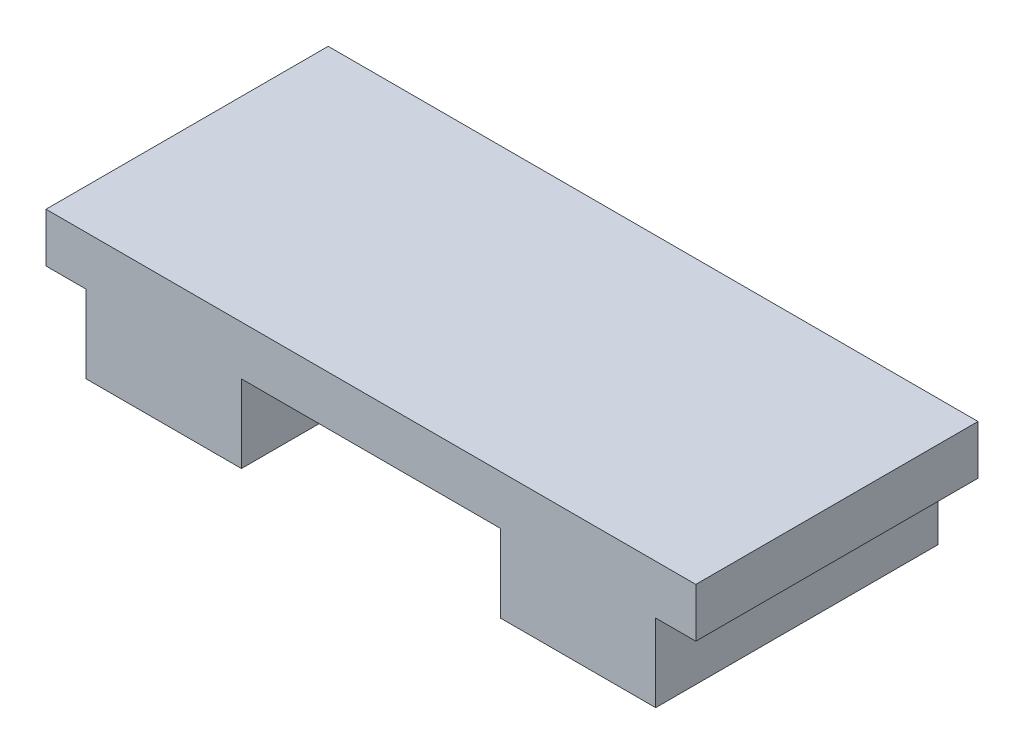
ISO-10303-21;
HEADER;
FILE_DESCRIPTION(('STEP AP214'),'2;1');
FILE_NAME('part.step','',(''),(''),'','','');
FILE_SCHEMA(('AUTOMOTIVE_DESIGN { 1 0 10303 214 1 1 1 1 }'));
ENDSEC;
DATA;
#1=APPLICATION_CONTEXT('core data for automotive mechanical design processes');
#2=APPLICATION_PROTOCOL_DEFINITION('international standard','automotive_design',2000,#1);
#3=PRODUCT_CONTEXT('',#1,'mechanical');
#4=PRODUCT('Part','Part','',(#3));
#5=PRODUCT_RELATED_PRODUCT_CATEGORY('part','',(#4));
#6=PRODUCT_DEFINITION_FORMATION('','',#4);
#7=PRODUCT_DEFINITION_CONTEXT('part definition',#1,'design');
#8=PRODUCT_DEFINITION('design','',#6,#7);
#9=PRODUCT_DEFINITION_SHAPE('','',#8);
#10=(LENGTH_UNIT() NAMED_UNIT(*) SI_UNIT(.MILLI.,.METRE.));
#11=(NAMED_UNIT(*) PLANE_ANGLE_UNIT() SI_UNIT($,.RADIAN.));
#12=(NAMED_UNIT(*) SI_UNIT($,.STERADIAN.) SOLID_ANGLE_UNIT());
#13=UNCERTAINTY_MEASURE_WITH_UNIT(LENGTH_MEASURE(1.E-05),#10,'distance_accuracy_value','');
#14=(GEOMETRIC_REPRESENTATION_CONTEXT(3) GLOBAL_UNCERTAINTY_ASSIGNED_CONTEXT((#13)) GLOBAL_UNIT_ASSIGNED_CONTEXT((#10,
#11,#12)) REPRESENTATION_CONTEXT('',''));
#15=CARTESIAN_POINT('',(0.,0.,0.));
#16=DIRECTION('',(0.,0.,1.));
#17=DIRECTION('',(1.,0.,0.));
#18=AXIS2_PLACEMENT_3D('',#15,#16,#17);
#19=CARTESIAN_POINT('',(0.,3.,0.));
#20=DIRECTION('',(0.,-1.,0.));
#21=DIRECTION('',(0.,0.,-1.));
#22=AXIS2_PLACEMENT_3D('',#19,#20,#21);
#23=PLANE('',#22);
#24=DIRECTION('',(1.,0.,0.));
#25=VECTOR('',#24,1.);
#26=CARTESIAN_POINT('',(-12.55,3.,5.45));
#27=LINE('',#26,#25);
#28=CARTESIAN_POINT('',(11.,3.,5.45));
#29=VERTEX_POINT('',#28);
#30=CARTESIAN_POINT('',(12.55,3.,5.45));
#31=VERTEX_POINT('',#30);
#32=EDGE_CURVE('E147',#29,#31,#27,.T.);
#33=ORIENTED_EDGE('',*,*,#32,.F.);
#34=DIRECTION('',(0.,0.,-1.));
#35=VECTOR('',#34,1.);
#36=CARTESIAN_POINT('',(11.,3.,5.45));
#37=LINE('',#36,#35);
#38=CARTESIAN_POINT('',(11.,3.,-5.45));
#39=VERTEX_POINT('',#38);
#40=EDGE_CURVE('E52',#29,#39,#37,.T.);
#41=ORIENTED_EDGE('',*,*,#40,.T.);
#42=DIRECTION('',(-1.,0.,0.));
#43=VECTOR('',#42,1.);
#44=CARTESIAN_POINT('',(-12.55,3.,-5.45));
#45=LINE('',#44,#43);
#46=CARTESIAN_POINT('',(12.55,3.,-5.45));
#47=VERTEX_POINT('',#46);
#48=EDGE_CURVE('E145',#47,#39,#45,.T.);
#49=ORIENTED_EDGE('',*,*,#48,.F.);
#50=DIRECTION('',(0.,0.,-1.));
#51=VECTOR('',#50,1.);
#52=CARTESIAN_POINT('',(12.55,3.,5.45));
#53=LINE('',#52,#51);
#54=EDGE_CURVE('E139',#31,#47,#53,.T.);
#55=ORIENTED_EDGE('',*,*,#54,.F.);
#56=EDGE_LOOP('',(#33,#41,#49,#55));
#57=FACE_BOUND('',#56,.T.);
#58=ADVANCED_FACE('F37',(#57),#23,.T.);
#59=CARTESIAN_POINT('',(5.,3.,-5.45));
#60=VERTEX_POINT('',#59);
#61=CARTESIAN_POINT('',(-5.,3.,-5.45));
#62=VERTEX_POINT('',#61);
#63=EDGE_CURVE('E85',#60,#62,#45,.T.);
#64=ORIENTED_EDGE('',*,*,#63,.F.);
#65=DIRECTION('',(0.,0.,1.));
#66=VECTOR('',#65,1.);
#67=CARTESIAN_POINT('',(5.,3.,5.45));
#68=LINE('',#67,#66);
#69=CARTESIAN_POINT('',(5.,3.,5.45));
#70=VERTEX_POINT('',#69);
#71=EDGE_CURVE('E148',#60,#70,#68,.T.);
#72=ORIENTED_EDGE('',*,*,#71,.T.);
#73=CARTESIAN_POINT('',(-5.,3.,5.45));
#74=VERTEX_POINT('',#73);
#75=EDGE_CURVE('E196',#74,#70,#27,.T.);
#76=ORIENTED_EDGE('',*,*,#75,.F.);
#77=DIRECTION('',(0.,0.,-1.));
#78=VECTOR('',#77,1.);
#79=CARTESIAN_POINT('',(-5.,3.,5.45));
#80=LINE('',#79,#78);
#81=EDGE_CURVE('E211',#74,#62,#80,.T.);
#82=ORIENTED_EDGE('',*,*,#81,.T.);
#83=EDGE_LOOP('',(#64,#72,#76,#82));
#84=FACE_BOUND('',#83,.T.);
#85=ADVANCED_FACE('F194',(#84),#23,.T.);
#86=CARTESIAN_POINT('',(-5.,3.,5.45));
#87=DIRECTION('',(-1.,0.,0.));
#88=DIRECTION('',(0.,0.,1.));
#89=AXIS2_PLACEMENT_3D('',#86,#87,#88);
#90=PLANE('',#89);
#91=DIRECTION('',(0.,0.,-1.));
#92=VECTOR('',#91,1.);
#93=CARTESIAN_POINT('',(-5.,0.,5.45));
#94=LINE('',#93,#92);
#95=CARTESIAN_POINT('',(-5.,0.,5.45));
#96=VERTEX_POINT('',#95);
#97=CARTESIAN_POINT('',(-5.,0.,-5.45));
#98=VERTEX_POINT('',#97);
#99=EDGE_CURVE('E210',#96,#98,#94,.T.);
#100=ORIENTED_EDGE('',*,*,#99,.T.);
#101=DIRECTION('',(0.,-1.,0.));
#102=VECTOR('',#101,1.);
#103=CARTESIAN_POINT('',(-5.,3.,-5.45));
#104=LINE('',#103,#102);
#105=EDGE_CURVE('E11',#62,#98,#104,.T.);
#106=ORIENTED_EDGE('',*,*,#105,.F.);
#107=ORIENTED_EDGE('',*,*,#81,.F.);
#108=DIRECTION('',(0.,-1.,0.));
#109=VECTOR('',#108,1.);
#110=CARTESIAN_POINT('',(-5.,3.,5.45));
#111=LINE('',#110,#109);
#112=EDGE_CURVE('E61',#74,#96,#111,.T.);
#113=ORIENTED_EDGE('',*,*,#112,.T.);
#114=EDGE_LOOP('',(#100,#106,#107,#113));
#115=FACE_BOUND('',#114,.T.);
#116=ADVANCED_FACE('F39',(#115),#90,.F.);
#117=CARTESIAN_POINT('',(-11.,3.,-5.45));
#118=DIRECTION('',(0.,0.,1.));
#119=DIRECTION('',(1.,0.,0.));
#120=AXIS2_PLACEMENT_3D('',#117,#118,#119);
#121=PLANE('',#120);
#122=DIRECTION('',(-1.,0.,0.));
#123=VECTOR('',#122,1.);
#124=CARTESIAN_POINT('',(-11.,0.,-5.45));
#125=LINE('',#124,#123);
#126=CARTESIAN_POINT('',(-11.,0.,-5.45));
#127=VERTEX_POINT('',#126);
#128=EDGE_CURVE('E218',#98,#127,#125,.T.);
#129=ORIENTED_EDGE('',*,*,#128,.T.);
#130=DIRECTION('',(0.,-1.,0.));
#131=VECTOR('',#130,1.);
#132=CARTESIAN_POINT('',(-11.,3.,-5.45));
#133=LINE('',#132,#131);
#134=CARTESIAN_POINT('',(-11.,3.,-5.45));
#135=VERTEX_POINT('',#134);
#136=EDGE_CURVE('E45',#135,#127,#133,.T.);
#137=ORIENTED_EDGE('',*,*,#136,.F.);
#138=CARTESIAN_POINT('',(-12.55,3.,-5.45));
#139=VERTEX_POINT('',#138);
#140=EDGE_CURVE('E157',#135,#139,#45,.T.);
#141=ORIENTED_EDGE('',*,*,#140,.T.);
#142=DIRECTION('',(0.,-1.,0.));
#143=VECTOR('',#142,1.);
#144=CARTESIAN_POINT('',(-12.55,4.9,-5.45));
#145=LINE('',#144,#143);
#146=CARTESIAN_POINT('',(-12.55,4.9,-5.45));
#147=VERTEX_POINT('',#146);
#148=EDGE_CURVE('E207',#147,#139,#145,.T.);
#149=ORIENTED_EDGE('',*,*,#148,.F.);
#150=DIRECTION('',(-1.,0.,0.));
#151=VECTOR('',#150,1.);
#152=CARTESIAN_POINT('',(-12.55,4.9,-5.45));
#153=LINE('',#152,#151);
#154=CARTESIAN_POINT('',(12.55,4.9,-5.45));
#155=VERTEX_POINT('',#154);
#156=EDGE_CURVE('E171',#155,#147,#153,.T.);
#157=ORIENTED_EDGE('',*,*,#156,.F.);
#158=DIRECTION('',(0.,-1.,0.));
#159=VECTOR('',#158,1.);
#160=CARTESIAN_POINT('',(12.55,4.9,-5.45));
#161=LINE('',#160,#159);
#162=EDGE_CURVE('E153',#155,#47,#161,.T.);
#163=ORIENTED_EDGE('',*,*,#162,.T.);
#164=ORIENTED_EDGE('',*,*,#48,.T.);
#165=DIRECTION('',(0.,-1.,0.));
#166=VECTOR('',#165,1.);
#167=CARTESIAN_POINT('',(11.,3.,-5.45));
#168=LINE('',#167,#166);
#169=CARTESIAN_POINT('',(11.,0.,-5.45));
#170=VERTEX_POINT('',#169);
#171=EDGE_CURVE('E134',#39,#170,#168,.T.);
#172=ORIENTED_EDGE('',*,*,#171,.T.);
#173=DIRECTION('',(-1.,0.,0.));
#174=VECTOR('',#173,1.);
#175=CARTESIAN_POINT('',(11.,0.,-5.45));
#176=LINE('',#175,#174);
#177=CARTESIAN_POINT('',(5.,0.,-5.45));
#178=VERTEX_POINT('',#177);
#179=EDGE_CURVE('E187',#170,#178,#176,.T.);
#180=ORIENTED_EDGE('',*,*,#179,.T.);
#181=DIRECTION('',(0.,-1.,0.));
#182=VECTOR('',#181,1.);
#183=CARTESIAN_POINT('',(5.,3.,-5.45));
#184=LINE('',#183,#182);
#185=EDGE_CURVE('E140',#60,#178,#184,.T.);
#186=ORIENTED_EDGE('',*,*,#185,.F.);
#187=ORIENTED_EDGE('',*,*,#63,.T.);
#188=ORIENTED_EDGE('',*,*,#105,.T.);
#189=EDGE_LOOP('',(#129,#137,#141,#149,#157,#163,#164,#172,#180,#186,#187,#188));
#190=FACE_BOUND('',#189,.T.);
#191=ADVANCED_FACE('F151',(#190),#121,.F.);
#192=CARTESIAN_POINT('',(-11.,3.,5.45));
#193=DIRECTION('',(1.,0.,0.));
#194=DIRECTION('',(0.,0.,-1.));
#195=AXIS2_PLACEMENT_3D('',#192,#193,#194);
#196=PLANE('',#195);
#197=DIRECTION('',(0.,0.,1.));
#198=VECTOR('',#197,1.);
#199=CARTESIAN_POINT('',(-11.,0.,5.45));
#200=LINE('',#199,#198);
#201=CARTESIAN_POINT('',(-11.,0.,5.45));
#202=VERTEX_POINT('',#201);
#203=EDGE_CURVE('E220',#127,#202,#200,.T.);
#204=ORIENTED_EDGE('',*,*,#203,.T.);
#205=DIRECTION('',(0.,-1.,0.));
#206=VECTOR('',#205,1.);
#207=CARTESIAN_POINT('',(-11.,3.,5.45));
#208=LINE('',#207,#206);
#209=CARTESIAN_POINT('',(-11.,3.,5.45));
#210=VERTEX_POINT('',#209);
#211=EDGE_CURVE('E224',#210,#202,#208,.T.);
#212=ORIENTED_EDGE('',*,*,#211,.F.);
#213=DIRECTION('',(0.,0.,1.));
#214=VECTOR('',#213,1.);
#215=CARTESIAN_POINT('',(-11.,3.,5.45));
#216=LINE('',#215,#214);
#217=EDGE_CURVE('E213',#135,#210,#216,.T.);
#218=ORIENTED_EDGE('',*,*,#217,.F.);
#219=ORIENTED_EDGE('',*,*,#136,.T.);
#220=EDGE_LOOP('',(#204,#212,#218,#219));
#221=FACE_BOUND('',#220,.T.);
#222=ADVANCED_FACE('F229',(#221),#196,.F.);
#223=CARTESIAN_POINT('',(-11.,3.,5.45));
#224=DIRECTION('',(0.,0.,-1.));
#225=DIRECTION('',(-1.,0.,0.));
#226=AXIS2_PLACEMENT_3D('',#223,#224,#225);
#227=PLANE('',#226);
#228=DIRECTION('',(1.,0.,0.));
#229=VECTOR('',#228,1.);
#230=CARTESIAN_POINT('',(-11.,0.,5.45));
#231=LINE('',#230,#229);
#232=EDGE_CURVE('E80',#202,#96,#231,.T.);
#233=ORIENTED_EDGE('',*,*,#232,.T.);
#234=ORIENTED_EDGE('',*,*,#112,.F.);
#235=ORIENTED_EDGE('',*,*,#75,.T.);
#236=DIRECTION('',(0.,-1.,0.));
#237=VECTOR('',#236,1.);
#238=CARTESIAN_POINT('',(5.,3.,5.45));
#239=LINE('',#238,#237);
#240=CARTESIAN_POINT('',(5.,0.,5.45));
#241=VERTEX_POINT('',#240);
#242=EDGE_CURVE('E179',#70,#241,#239,.T.);
#243=ORIENTED_EDGE('',*,*,#242,.T.);
#244=DIRECTION('',(1.,0.,0.));
#245=VECTOR('',#244,1.);
#246=CARTESIAN_POINT('',(11.,0.,5.45));
#247=LINE('',#246,#245);
#248=CARTESIAN_POINT('',(11.,0.,5.45));
#249=VERTEX_POINT('',#248);
#250=EDGE_CURVE('E149',#241,#249,#247,.T.);
#251=ORIENTED_EDGE('',*,*,#250,.T.);
#252=DIRECTION('',(0.,-1.,0.));
#253=VECTOR('',#252,1.);
#254=CARTESIAN_POINT('',(11.,3.,5.45));
#255=LINE('',#254,#253);
#256=EDGE_CURVE('E182',#29,#249,#255,.T.);
#257=ORIENTED_EDGE('',*,*,#256,.F.);
#258=ORIENTED_EDGE('',*,*,#32,.T.);
#259=DIRECTION('',(0.,-1.,0.));
#260=VECTOR('',#259,1.);
#261=CARTESIAN_POINT('',(12.55,4.9,5.45));
#262=LINE('',#261,#260);
#263=CARTESIAN_POINT('',(12.55,4.9,5.45));
#264=VERTEX_POINT('',#263);
#265=EDGE_CURVE('E168',#264,#31,#262,.T.);
#266=ORIENTED_EDGE('',*,*,#265,.F.);
#267=DIRECTION('',(1.,0.,0.));
#268=VECTOR('',#267,1.);
#269=CARTESIAN_POINT('',(-12.55,4.9,5.45));
#270=LINE('',#269,#268);
#271=CARTESIAN_POINT('',(-12.55,4.9,5.45));
#272=VERTEX_POINT('',#271);
#273=EDGE_CURVE('E166',#272,#264,#270,.T.);
#274=ORIENTED_EDGE('',*,*,#273,.F.);
#275=DIRECTION('',(0.,-1.,0.));
#276=VECTOR('',#275,1.);
#277=CARTESIAN_POINT('',(-12.55,4.9,5.45));
#278=LINE('',#277,#276);
#279=CARTESIAN_POINT('',(-12.55,3.,5.45));
#280=VERTEX_POINT('',#279);
#281=EDGE_CURVE('E204',#272,#280,#278,.T.);
#282=ORIENTED_EDGE('',*,*,#281,.T.);
#283=EDGE_CURVE('E175',#280,#210,#27,.T.);
#284=ORIENTED_EDGE('',*,*,#283,.T.);
#285=ORIENTED_EDGE('',*,*,#211,.T.);
#286=EDGE_LOOP('',(#233,#234,#235,#243,#251,#257,#258,#266,#274,#282,#284,#285));
#287=FACE_BOUND('',#286,.T.);
#288=ADVANCED_FACE('F198',(#287),#227,.F.);
#289=CARTESIAN_POINT('',(0.,0.,0.));
#290=DIRECTION('',(0.,-1.,0.));
#291=DIRECTION('',(0.,0.,-1.));
#292=AXIS2_PLACEMENT_3D('',#289,#290,#291);
#293=PLANE('',#292);
#294=ORIENTED_EDGE('',*,*,#99,.F.);
#295=ORIENTED_EDGE('',*,*,#232,.F.);
#296=ORIENTED_EDGE('',*,*,#203,.F.);
#297=ORIENTED_EDGE('',*,*,#128,.F.);
#298=EDGE_LOOP('',(#294,#295,#296,#297));
#299=FACE_BOUND('',#298,.T.);
#300=ADVANCED_FACE('F232',(#299),#293,.T.);
#301=CARTESIAN_POINT('',(12.55,4.9,5.45));
#302=DIRECTION('',(-1.,0.,0.));
#303=DIRECTION('',(0.,0.,1.));
#304=AXIS2_PLACEMENT_3D('',#301,#302,#303);
#305=PLANE('',#304);
#306=ORIENTED_EDGE('',*,*,#54,.T.);
#307=ORIENTED_EDGE('',*,*,#162,.F.);
#308=DIRECTION('',(0.,0.,-1.));
#309=VECTOR('',#308,1.);
#310=CARTESIAN_POINT('',(12.55,4.9,5.45));
#311=LINE('',#310,#309);
#312=EDGE_CURVE('E173',#264,#155,#311,.T.);
#313=ORIENTED_EDGE('',*,*,#312,.F.);
#314=ORIENTED_EDGE('',*,*,#265,.T.);
#315=EDGE_LOOP('',(#306,#307,#313,#314));
#316=FACE_BOUND('',#315,.T.);
#317=ADVANCED_FACE('F265',(#316),#305,.F.);
#318=CARTESIAN_POINT('',(-12.55,4.9,5.45));
#319=DIRECTION('',(1.,0.,0.));
#320=DIRECTION('',(0.,0.,-1.));
#321=AXIS2_PLACEMENT_3D('',#318,#319,#320);
#322=PLANE('',#321);
#323=DIRECTION('',(0.,0.,1.));
#324=VECTOR('',#323,1.);
#325=CARTESIAN_POINT('',(-12.55,3.,5.45));
#326=LINE('',#325,#324);
#327=EDGE_CURVE('E155',#139,#280,#326,.T.);
#328=ORIENTED_EDGE('',*,*,#327,.T.);
#329=ORIENTED_EDGE('',*,*,#281,.F.);
#330=DIRECTION('',(0.,0.,1.));
#331=VECTOR('',#330,1.);
#332=CARTESIAN_POINT('',(-12.55,4.9,5.45));
#333=LINE('',#332,#331);
#334=EDGE_CURVE('E169',#147,#272,#333,.T.);
#335=ORIENTED_EDGE('',*,*,#334,.F.);
#336=ORIENTED_EDGE('',*,*,#148,.T.);
#337=EDGE_LOOP('',(#328,#329,#335,#336));
#338=FACE_BOUND('',#337,.T.);
#339=ADVANCED_FACE('F255',(#338),#322,.F.);
#340=CARTESIAN_POINT('',(0.,4.9,0.));
#341=DIRECTION('',(0.,-1.,0.));
#342=DIRECTION('',(0.,0.,-1.));
#343=AXIS2_PLACEMENT_3D('',#340,#341,#342);
#344=PLANE('',#343);
#345=ORIENTED_EDGE('',*,*,#312,.T.);
#346=ORIENTED_EDGE('',*,*,#156,.T.);
#347=ORIENTED_EDGE('',*,*,#334,.T.);
#348=ORIENTED_EDGE('',*,*,#273,.T.);
#349=EDGE_LOOP('',(#345,#346,#347,#348));
#350=FACE_BOUND('',#349,.T.);
#351=ADVANCED_FACE('F247',(#350),#344,.F.);
#352=ORIENTED_EDGE('',*,*,#140,.F.);
#353=ORIENTED_EDGE('',*,*,#217,.T.);
#354=ORIENTED_EDGE('',*,*,#283,.F.);
#355=ORIENTED_EDGE('',*,*,#327,.F.);
#356=EDGE_LOOP('',(#352,#353,#354,#355));
#357=FACE_BOUND('',#356,.T.);
#358=ADVANCED_FACE('F240',(#357),#23,.T.);
#359=CARTESIAN_POINT('',(11.,3.,5.45));
#360=DIRECTION('',(-1.,0.,0.));
#361=DIRECTION('',(0.,0.,1.));
#362=AXIS2_PLACEMENT_3D('',#359,#360,#361);
#363=PLANE('',#362);
#364=DIRECTION('',(0.,0.,-1.));
#365=VECTOR('',#364,1.);
#366=CARTESIAN_POINT('',(11.,0.,5.45));
#367=LINE('',#366,#365);
#368=EDGE_CURVE('E137',#249,#170,#367,.T.);
#369=ORIENTED_EDGE('',*,*,#368,.T.);
#370=ORIENTED_EDGE('',*,*,#171,.F.);
#371=ORIENTED_EDGE('',*,*,#40,.F.);
#372=ORIENTED_EDGE('',*,*,#256,.T.);
#373=EDGE_LOOP('',(#369,#370,#371,#372));
#374=FACE_BOUND('',#373,.T.);
#375=ADVANCED_FACE('F135',(#374),#363,.F.);
#376=CARTESIAN_POINT('',(5.,3.,5.45));
#377=DIRECTION('',(1.,0.,0.));
#378=DIRECTION('',(0.,0.,-1.));
#379=AXIS2_PLACEMENT_3D('',#376,#377,#378);
#380=PLANE('',#379);
#381=DIRECTION('',(0.,0.,1.));
#382=VECTOR('',#381,1.);
#383=CARTESIAN_POINT('',(5.,0.,5.45));
#384=LINE('',#383,#382);
#385=EDGE_CURVE('E185',#178,#241,#384,.T.);
#386=ORIENTED_EDGE('',*,*,#385,.T.);
#387=ORIENTED_EDGE('',*,*,#242,.F.);
#388=ORIENTED_EDGE('',*,*,#71,.F.);
#389=ORIENTED_EDGE('',*,*,#185,.T.);
#390=EDGE_LOOP('',(#386,#387,#388,#389));
#391=FACE_BOUND('',#390,.T.);
#392=ADVANCED_FACE('F253',(#391),#380,.F.);
#393=CARTESIAN_POINT('',(0.,0.,0.));
#394=DIRECTION('',(0.,1.,0.));
#395=DIRECTION('',(0.,0.,1.));
#396=AXIS2_PLACEMENT_3D('',#393,#394,#395);
#397=PLANE('',#396);
#398=ORIENTED_EDGE('',*,*,#368,.F.);
#399=ORIENTED_EDGE('',*,*,#250,.F.);
#400=ORIENTED_EDGE('',*,*,#385,.F.);
#401=ORIENTED_EDGE('',*,*,#179,.F.);
#402=EDGE_LOOP('',(#398,#399,#400,#401));
#403=FACE_BOUND('',#402,.T.);
#404=ADVANCED_FACE('F351',(#403),#397,.F.);
#405=CLOSED_SHELL('',(#58,#85,#116,#191,#222,#288,#300,#317,#339,#351,#358,#375,#392,#404));
#406=MANIFOLD_SOLID_BREP('B2',#405);
#407=ADVANCED_BREP_SHAPE_REPRESENTATION('',(#18,#406),#14);
#408=SHAPE_DEFINITION_REPRESENTATION(#9,#407);
ENDSEC;
END-ISO-10303-21;
